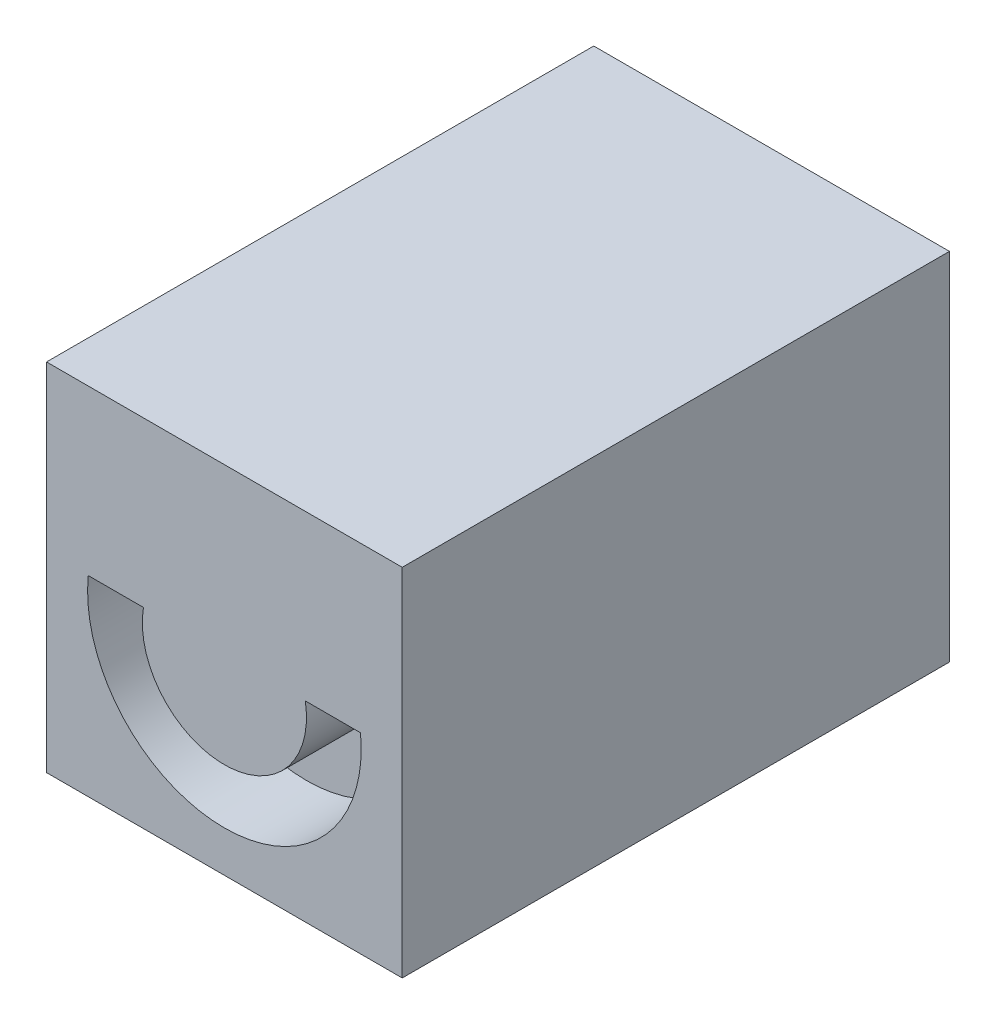
ISO-10303-21;
HEADER;
FILE_DESCRIPTION(('STEP AP214'),'2;1');
FILE_NAME('part.step','',(''),(''),'','','');
FILE_SCHEMA(('AUTOMOTIVE_DESIGN { 1 0 10303 214 1 1 1 1 }'));
ENDSEC;
DATA;
#1=APPLICATION_CONTEXT('core data for automotive mechanical design processes');
#2=APPLICATION_PROTOCOL_DEFINITION('international standard','automotive_design',2000,#1);
#3=PRODUCT_CONTEXT('',#1,'mechanical');
#4=PRODUCT('Part','Part','',(#3));
#5=PRODUCT_RELATED_PRODUCT_CATEGORY('part','',(#4));
#6=PRODUCT_DEFINITION_FORMATION('','',#4);
#7=PRODUCT_DEFINITION_CONTEXT('part definition',#1,'design');
#8=PRODUCT_DEFINITION('design','',#6,#7);
#9=PRODUCT_DEFINITION_SHAPE('','',#8);
#10=(LENGTH_UNIT() NAMED_UNIT(*) SI_UNIT(.MILLI.,.METRE.));
#11=(NAMED_UNIT(*) PLANE_ANGLE_UNIT() SI_UNIT($,.RADIAN.));
#12=(NAMED_UNIT(*) SI_UNIT($,.STERADIAN.) SOLID_ANGLE_UNIT());
#13=UNCERTAINTY_MEASURE_WITH_UNIT(LENGTH_MEASURE(1.E-05),#10,'distance_accuracy_value','');
#14=(GEOMETRIC_REPRESENTATION_CONTEXT(3) GLOBAL_UNCERTAINTY_ASSIGNED_CONTEXT((#13)) GLOBAL_UNIT_ASSIGNED_CONTEXT((#10,
#11,#12)) REPRESENTATION_CONTEXT('',''));
#15=CARTESIAN_POINT('',(0.,0.,0.));
#16=DIRECTION('',(0.,0.,1.));
#17=DIRECTION('',(1.,0.,0.));
#18=AXIS2_PLACEMENT_3D('',#15,#16,#17);
#19=CARTESIAN_POINT('',(65.,0.,200.));
#20=DIRECTION('',(1.,0.,0.));
#21=DIRECTION('',(0.,1.,0.));
#22=AXIS2_PLACEMENT_3D('',#19,#20,#21);
#23=PLANE('',#22);
#24=DIRECTION('',(0.,0.,-1.));
#25=VECTOR('',#24,1.);
#26=CARTESIAN_POINT('',(65.,-65.,200.));
#27=LINE('',#26,#25);
#28=CARTESIAN_POINT('',(65.,-65.,200.));
#29=VERTEX_POINT('',#28);
#30=CARTESIAN_POINT('',(65.,-65.,0.));
#31=VERTEX_POINT('',#30);
#32=EDGE_CURVE('E82',#29,#31,#27,.T.);
#33=ORIENTED_EDGE('',*,*,#32,.T.);
#34=DIRECTION('',(0.,-1.,0.));
#35=VECTOR('',#34,1.);
#36=CARTESIAN_POINT('',(65.,0.,0.));
#37=LINE('',#36,#35);
#38=CARTESIAN_POINT('',(65.,65.,0.));
#39=VERTEX_POINT('',#38);
#40=EDGE_CURVE('E133',#39,#31,#37,.T.);
#41=ORIENTED_EDGE('',*,*,#40,.F.);
#42=DIRECTION('',(0.,0.,-1.));
#43=VECTOR('',#42,1.);
#44=CARTESIAN_POINT('',(65.,65.,200.));
#45=LINE('',#44,#43);
#46=CARTESIAN_POINT('',(65.,65.,200.));
#47=VERTEX_POINT('',#46);
#48=EDGE_CURVE('E12',#47,#39,#45,.T.);
#49=ORIENTED_EDGE('',*,*,#48,.F.);
#50=DIRECTION('',(0.,-1.,0.));
#51=VECTOR('',#50,1.);
#52=CARTESIAN_POINT('',(65.,0.,200.));
#53=LINE('',#52,#51);
#54=EDGE_CURVE('E125',#47,#29,#53,.T.);
#55=ORIENTED_EDGE('',*,*,#54,.T.);
#56=EDGE_LOOP('',(#33,#41,#49,#55));
#57=FACE_BOUND('',#56,.T.);
#58=ADVANCED_FACE('F36',(#57),#23,.T.);
#59=CARTESIAN_POINT('',(0.,65.,200.));
#60=DIRECTION('',(0.,1.,0.));
#61=DIRECTION('',(0.,0.,1.));
#62=AXIS2_PLACEMENT_3D('',#59,#60,#61);
#63=PLANE('',#62);
#64=ORIENTED_EDGE('',*,*,#48,.T.);
#65=DIRECTION('',(1.,0.,0.));
#66=VECTOR('',#65,1.);
#67=CARTESIAN_POINT('',(0.,65.,0.));
#68=LINE('',#67,#66);
#69=CARTESIAN_POINT('',(-65.,65.,0.));
#70=VERTEX_POINT('',#69);
#71=EDGE_CURVE('E114',#70,#39,#68,.T.);
#72=ORIENTED_EDGE('',*,*,#71,.F.);
#73=DIRECTION('',(0.,0.,-1.));
#74=VECTOR('',#73,1.);
#75=CARTESIAN_POINT('',(-65.,65.,200.));
#76=LINE('',#75,#74);
#77=CARTESIAN_POINT('',(-65.,65.,200.));
#78=VERTEX_POINT('',#77);
#79=EDGE_CURVE('E45',#78,#70,#76,.T.);
#80=ORIENTED_EDGE('',*,*,#79,.F.);
#81=DIRECTION('',(1.,0.,0.));
#82=VECTOR('',#81,1.);
#83=CARTESIAN_POINT('',(0.,65.,200.));
#84=LINE('',#83,#82);
#85=EDGE_CURVE('E112',#78,#47,#84,.T.);
#86=ORIENTED_EDGE('',*,*,#85,.T.);
#87=EDGE_LOOP('',(#64,#72,#80,#86));
#88=FACE_BOUND('',#87,.T.);
#89=ADVANCED_FACE('F110',(#88),#63,.T.);
#90=CARTESIAN_POINT('',(-65.,0.,200.));
#91=DIRECTION('',(1.,0.,0.));
#92=DIRECTION('',(0.,0.,-1.));
#93=AXIS2_PLACEMENT_3D('',#90,#91,#92);
#94=PLANE('',#93);
#95=ORIENTED_EDGE('',*,*,#79,.T.);
#96=DIRECTION('',(0.,-1.,0.));
#97=VECTOR('',#96,1.);
#98=CARTESIAN_POINT('',(-65.,0.,0.));
#99=LINE('',#98,#97);
#100=CARTESIAN_POINT('',(-65.,-65.,0.));
#101=VERTEX_POINT('',#100);
#102=EDGE_CURVE('E137',#70,#101,#99,.T.);
#103=ORIENTED_EDGE('',*,*,#102,.T.);
#104=DIRECTION('',(0.,0.,-1.));
#105=VECTOR('',#104,1.);
#106=CARTESIAN_POINT('',(-65.,-65.,200.));
#107=LINE('',#106,#105);
#108=CARTESIAN_POINT('',(-65.,-65.,200.));
#109=VERTEX_POINT('',#108);
#110=EDGE_CURVE('E118',#109,#101,#107,.T.);
#111=ORIENTED_EDGE('',*,*,#110,.F.);
#112=DIRECTION('',(0.,-1.,0.));
#113=VECTOR('',#112,1.);
#114=CARTESIAN_POINT('',(-65.,0.,200.));
#115=LINE('',#114,#113);
#116=EDGE_CURVE('E121',#78,#109,#115,.T.);
#117=ORIENTED_EDGE('',*,*,#116,.F.);
#118=EDGE_LOOP('',(#95,#103,#111,#117));
#119=FACE_BOUND('',#118,.T.);
#120=ADVANCED_FACE('F122',(#119),#94,.F.);
#121=CARTESIAN_POINT('',(0.,0.,200.));
#122=DIRECTION('',(0.,0.,-1.));
#123=DIRECTION('',(-1.,0.,0.));
#124=AXIS2_PLACEMENT_3D('',#121,#122,#123);
#125=CYLINDRICAL_SURFACE('',#124,30.);
#126=DIRECTION('',(0.,0.,-1.));
#127=VECTOR('',#126,1.);
#128=CARTESIAN_POINT('',(-29.5803989154981,5.,200.));
#129=LINE('',#128,#127);
#130=CARTESIAN_POINT('',(-29.5803989154981,5.,200.));
#131=VERTEX_POINT('',#130);
#132=CARTESIAN_POINT('',(-29.5803989154981,5.,170.));
#133=VERTEX_POINT('',#132);
#134=EDGE_CURVE('E132',#131,#133,#129,.T.);
#135=ORIENTED_EDGE('',*,*,#134,.T.);
#136=CARTESIAN_POINT('',(0.,0.,170.));
#137=DIRECTION('',(0.,0.,1.));
#138=DIRECTION('',(1.,0.,0.));
#139=AXIS2_PLACEMENT_3D('',#136,#137,#138);
#140=CIRCLE('',#139,30.);
#141=CARTESIAN_POINT('',(29.5803989154981,5.,170.));
#142=VERTEX_POINT('',#141);
#143=EDGE_CURVE('E53',#133,#142,#140,.T.);
#144=ORIENTED_EDGE('',*,*,#143,.T.);
#145=DIRECTION('',(0.,0.,-1.));
#146=VECTOR('',#145,1.);
#147=CARTESIAN_POINT('',(29.5803989154981,5.,200.));
#148=LINE('',#147,#146);
#149=CARTESIAN_POINT('',(29.5803989154981,5.,200.));
#150=VERTEX_POINT('',#149);
#151=EDGE_CURVE('E40',#150,#142,#148,.T.);
#152=ORIENTED_EDGE('',*,*,#151,.F.);
#153=CARTESIAN_POINT('',(0.,0.,200.));
#154=DIRECTION('',(0.,0.,1.));
#155=DIRECTION('',(1.,0.,0.));
#156=AXIS2_PLACEMENT_3D('',#153,#154,#155);
#157=CIRCLE('',#156,30.);
#158=EDGE_CURVE('E141',#131,#150,#157,.T.);
#159=ORIENTED_EDGE('',*,*,#158,.F.);
#160=EDGE_LOOP('',(#135,#144,#152,#159));
#161=FACE_BOUND('',#160,.T.);
#162=ADVANCED_FACE('F38',(#161),#125,.T.);
#163=CARTESIAN_POINT('',(0.,5.,200.));
#164=DIRECTION('',(0.,1.,0.));
#165=DIRECTION('',(0.,0.,1.));
#166=AXIS2_PLACEMENT_3D('',#163,#164,#165);
#167=PLANE('',#166);
#168=ORIENTED_EDGE('',*,*,#151,.T.);
#169=DIRECTION('',(1.,0.,0.));
#170=VECTOR('',#169,1.);
#171=CARTESIAN_POINT('',(0.,5.,170.));
#172=LINE('',#171,#170);
#173=CARTESIAN_POINT('',(49.749371855331,5.,170.));
#174=VERTEX_POINT('',#173);
#175=EDGE_CURVE('E157',#142,#174,#172,.T.);
#176=ORIENTED_EDGE('',*,*,#175,.T.);
#177=DIRECTION('',(0.,0.,-1.));
#178=VECTOR('',#177,1.);
#179=CARTESIAN_POINT('',(49.749371855331,5.,200.));
#180=LINE('',#179,#178);
#181=CARTESIAN_POINT('',(49.749371855331,5.,200.));
#182=VERTEX_POINT('',#181);
#183=EDGE_CURVE('E148',#182,#174,#180,.T.);
#184=ORIENTED_EDGE('',*,*,#183,.F.);
#185=DIRECTION('',(1.,0.,0.));
#186=VECTOR('',#185,1.);
#187=CARTESIAN_POINT('',(0.,5.,200.));
#188=LINE('',#187,#186);
#189=EDGE_CURVE('E91',#150,#182,#188,.T.);
#190=ORIENTED_EDGE('',*,*,#189,.F.);
#191=EDGE_LOOP('',(#168,#176,#184,#190));
#192=FACE_BOUND('',#191,.T.);
#193=ADVANCED_FACE('F156',(#192),#167,.F.);
#194=CARTESIAN_POINT('',(0.,0.,200.));
#195=DIRECTION('',(0.,0.,-1.));
#196=DIRECTION('',(-1.,0.,0.));
#197=AXIS2_PLACEMENT_3D('',#194,#195,#196);
#198=CYLINDRICAL_SURFACE('',#197,50.);
#199=CARTESIAN_POINT('',(0.,0.,170.));
#200=DIRECTION('',(0.,0.,1.));
#201=DIRECTION('',(1.,0.,0.));
#202=AXIS2_PLACEMENT_3D('',#199,#200,#201);
#203=CIRCLE('',#202,50.);
#204=CARTESIAN_POINT('',(-49.749371855331,5.,170.));
#205=VERTEX_POINT('',#204);
#206=EDGE_CURVE('E162',#205,#174,#203,.T.);
#207=ORIENTED_EDGE('',*,*,#206,.F.);
#208=DIRECTION('',(0.,0.,-1.));
#209=VECTOR('',#208,1.);
#210=CARTESIAN_POINT('',(-49.749371855331,5.,200.));
#211=LINE('',#210,#209);
#212=CARTESIAN_POINT('',(-49.749371855331,5.,200.));
#213=VERTEX_POINT('',#212);
#214=EDGE_CURVE('E146',#213,#205,#211,.T.);
#215=ORIENTED_EDGE('',*,*,#214,.F.);
#216=CARTESIAN_POINT('',(0.,0.,200.));
#217=DIRECTION('',(0.,0.,1.));
#218=DIRECTION('',(1.,0.,0.));
#219=AXIS2_PLACEMENT_3D('',#216,#217,#218);
#220=CIRCLE('',#219,50.);
#221=EDGE_CURVE('E167',#213,#182,#220,.T.);
#222=ORIENTED_EDGE('',*,*,#221,.T.);
#223=ORIENTED_EDGE('',*,*,#183,.T.);
#224=EDGE_LOOP('',(#207,#215,#222,#223));
#225=FACE_BOUND('',#224,.T.);
#226=ADVANCED_FACE('F178',(#225),#198,.F.);
#227=ORIENTED_EDGE('',*,*,#214,.T.);
#228=DIRECTION('',(1.,0.,0.));
#229=VECTOR('',#228,1.);
#230=CARTESIAN_POINT('',(0.,5.,170.));
#231=LINE('',#230,#229);
#232=EDGE_CURVE('E173',#205,#133,#231,.T.);
#233=ORIENTED_EDGE('',*,*,#232,.T.);
#234=ORIENTED_EDGE('',*,*,#134,.F.);
#235=EDGE_CURVE('E127',#213,#131,#188,.T.);
#236=ORIENTED_EDGE('',*,*,#235,.F.);
#237=EDGE_LOOP('',(#227,#233,#234,#236));
#238=FACE_BOUND('',#237,.T.);
#239=ADVANCED_FACE('F172',(#238),#167,.F.);
#240=CARTESIAN_POINT('',(0.,-65.,200.));
#241=DIRECTION('',(0.,1.,0.));
#242=DIRECTION('',(0.,0.,1.));
#243=AXIS2_PLACEMENT_3D('',#240,#241,#242);
#244=PLANE('',#243);
#245=ORIENTED_EDGE('',*,*,#110,.T.);
#246=DIRECTION('',(1.,0.,0.));
#247=VECTOR('',#246,1.);
#248=CARTESIAN_POINT('',(0.,-65.,0.));
#249=LINE('',#248,#247);
#250=EDGE_CURVE('E139',#101,#31,#249,.T.);
#251=ORIENTED_EDGE('',*,*,#250,.T.);
#252=ORIENTED_EDGE('',*,*,#32,.F.);
#253=DIRECTION('',(1.,0.,0.));
#254=VECTOR('',#253,1.);
#255=CARTESIAN_POINT('',(0.,-65.,200.));
#256=LINE('',#255,#254);
#257=EDGE_CURVE('E62',#109,#29,#256,.T.);
#258=ORIENTED_EDGE('',*,*,#257,.F.);
#259=EDGE_LOOP('',(#245,#251,#252,#258));
#260=FACE_BOUND('',#259,.T.);
#261=ADVANCED_FACE('F185',(#260),#244,.F.);
#262=CARTESIAN_POINT('',(0.,0.,200.));
#263=DIRECTION('',(0.,0.,1.));
#264=DIRECTION('',(1.,0.,0.));
#265=AXIS2_PLACEMENT_3D('',#262,#263,#264);
#266=PLANE('',#265);
#267=ORIENTED_EDGE('',*,*,#158,.T.);
#268=ORIENTED_EDGE('',*,*,#189,.T.);
#269=ORIENTED_EDGE('',*,*,#221,.F.);
#270=ORIENTED_EDGE('',*,*,#235,.T.);
#271=EDGE_LOOP('',(#267,#268,#269,#270));
#272=FACE_BOUND('',#271,.T.);
#273=ORIENTED_EDGE('',*,*,#54,.F.);
#274=ORIENTED_EDGE('',*,*,#85,.F.);
#275=ORIENTED_EDGE('',*,*,#116,.T.);
#276=ORIENTED_EDGE('',*,*,#257,.T.);
#277=EDGE_LOOP('',(#273,#274,#275,#276));
#278=FACE_BOUND('',#277,.T.);
#279=ADVANCED_FACE('F124',(#272,#278),#266,.T.);
#280=CARTESIAN_POINT('',(0.,0.,0.));
#281=DIRECTION('',(0.,0.,1.));
#282=DIRECTION('',(1.,0.,0.));
#283=AXIS2_PLACEMENT_3D('',#280,#281,#282);
#284=PLANE('',#283);
#285=ORIENTED_EDGE('',*,*,#40,.T.);
#286=ORIENTED_EDGE('',*,*,#250,.F.);
#287=ORIENTED_EDGE('',*,*,#102,.F.);
#288=ORIENTED_EDGE('',*,*,#71,.T.);
#289=EDGE_LOOP('',(#285,#286,#287,#288));
#290=FACE_BOUND('',#289,.T.);
#291=ADVANCED_FACE('F199',(#290),#284,.F.);
#292=CARTESIAN_POINT('',(0.,0.,170.));
#293=DIRECTION('',(0.,0.,1.));
#294=DIRECTION('',(1.,0.,0.));
#295=AXIS2_PLACEMENT_3D('',#292,#293,#294);
#296=PLANE('',#295);
#297=ORIENTED_EDGE('',*,*,#143,.F.);
#298=ORIENTED_EDGE('',*,*,#232,.F.);
#299=ORIENTED_EDGE('',*,*,#206,.T.);
#300=ORIENTED_EDGE('',*,*,#175,.F.);
#301=EDGE_LOOP('',(#297,#298,#299,#300));
#302=FACE_BOUND('',#301,.T.);
#303=ADVANCED_FACE('F177',(#302),#296,.T.);
#304=CLOSED_SHELL('',(#58,#89,#120,#162,#193,#226,#239,#261,#279,#291,#303));
#305=MANIFOLD_SOLID_BREP('B2',#304);
#306=ADVANCED_BREP_SHAPE_REPRESENTATION('',(#18,#305),#14);
#307=SHAPE_DEFINITION_REPRESENTATION(#9,#306);
ENDSEC;
END-ISO-10303-21;
